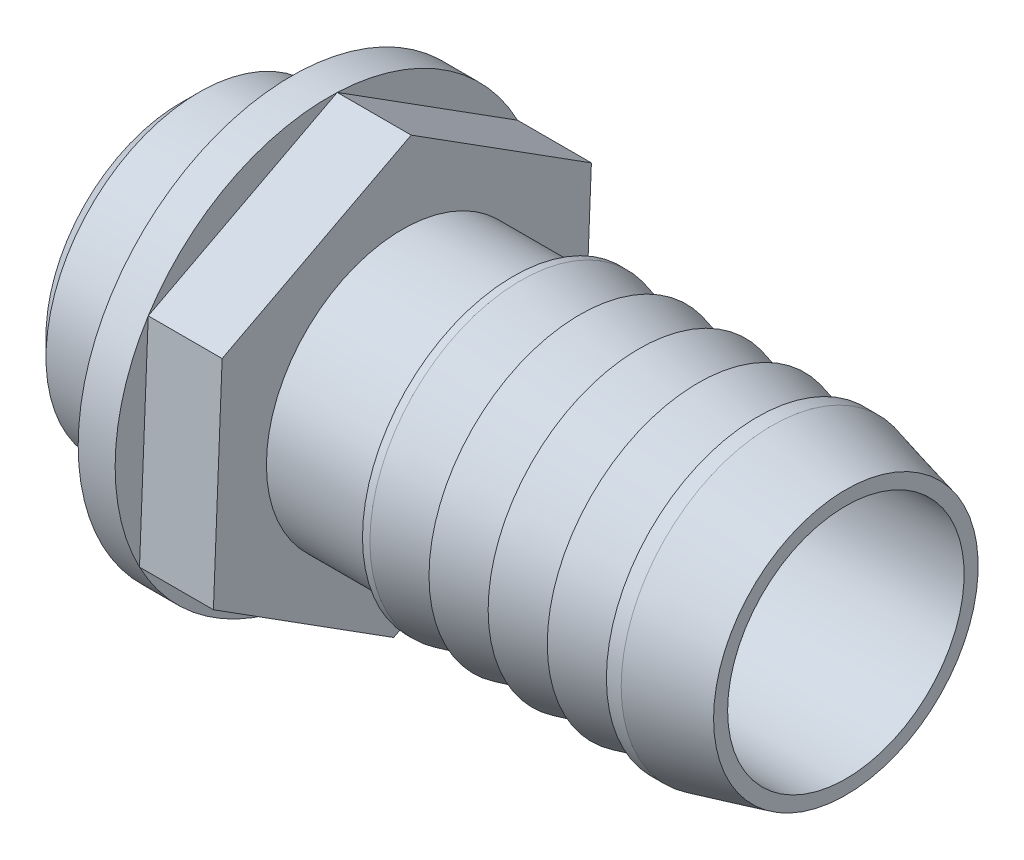
ISO-10303-21;
HEADER;
FILE_DESCRIPTION(('STEP AP214'),'2;1');
FILE_NAME('part.step','',(''),(''),'','','');
FILE_SCHEMA(('AUTOMOTIVE_DESIGN { 1 0 10303 214 1 1 1 1 }'));
ENDSEC;
DATA;
#1=APPLICATION_CONTEXT('core data for automotive mechanical design processes');
#2=APPLICATION_PROTOCOL_DEFINITION('international standard','automotive_design',2000,#1);
#3=PRODUCT_CONTEXT('',#1,'mechanical');
#4=PRODUCT('Part','Part','',(#3));
#5=PRODUCT_RELATED_PRODUCT_CATEGORY('part','',(#4));
#6=PRODUCT_DEFINITION_FORMATION('','',#4);
#7=PRODUCT_DEFINITION_CONTEXT('part definition',#1,'design');
#8=PRODUCT_DEFINITION('design','',#6,#7);
#9=PRODUCT_DEFINITION_SHAPE('','',#8);
#10=(LENGTH_UNIT() NAMED_UNIT(*) SI_UNIT(.MILLI.,.METRE.));
#11=(NAMED_UNIT(*) PLANE_ANGLE_UNIT() SI_UNIT($,.RADIAN.));
#12=(NAMED_UNIT(*) SI_UNIT($,.STERADIAN.) SOLID_ANGLE_UNIT());
#13=UNCERTAINTY_MEASURE_WITH_UNIT(LENGTH_MEASURE(1.E-05),#10,'distance_accuracy_value','');
#14=(GEOMETRIC_REPRESENTATION_CONTEXT(3) GLOBAL_UNCERTAINTY_ASSIGNED_CONTEXT((#13)) GLOBAL_UNIT_ASSIGNED_CONTEXT((#10,
#11,#12)) REPRESENTATION_CONTEXT('',''));
#15=CARTESIAN_POINT('',(0.,0.,0.));
#16=DIRECTION('',(0.,0.,1.));
#17=DIRECTION('',(1.,0.,0.));
#18=AXIS2_PLACEMENT_3D('',#15,#16,#17);
#19=CARTESIAN_POINT('',(-4.7625,0.,0.));
#20=DIRECTION('',(-1.,0.,0.));
#21=DIRECTION('',(0.,0.,1.));
#22=AXIS2_PLACEMENT_3D('',#19,#20,#21);
#23=PLANE('',#22);
#24=CARTESIAN_POINT('',(-4.7625,0.,0.));
#25=DIRECTION('',(-1.,0.,0.));
#26=DIRECTION('',(0.,0.,1.));
#27=AXIS2_PLACEMENT_3D('',#24,#25,#26);
#28=CIRCLE('',#27,9.16543552338531);
#29=CARTESIAN_POINT('',(-4.7625,0.,9.16543552338531));
#30=VERTEX_POINT('',#29);
#31=EDGE_CURVE('E140',#30,#30,#28,.T.);
#32=ORIENTED_EDGE('',*,*,#31,.T.);
#33=EDGE_LOOP('',(#32));
#34=FACE_BOUND('',#33,.T.);
#35=CARTESIAN_POINT('',(-4.7625,0.,0.));
#36=DIRECTION('',(-1.,0.,0.));
#37=DIRECTION('',(0.,0.,1.));
#38=AXIS2_PLACEMENT_3D('',#35,#36,#37);
#39=CIRCLE('',#38,6.5786);
#40=CARTESIAN_POINT('',(-4.7625,0.,-6.5786));
#41=VERTEX_POINT('',#40);
#42=EDGE_CURVE('E146',#41,#41,#39,.T.);
#43=ORIENTED_EDGE('',*,*,#42,.F.);
#44=EDGE_LOOP('',(#43));
#45=FACE_BOUND('',#44,.T.);
#46=ADVANCED_FACE('F39',(#34,#45),#23,.T.);
#47=CARTESIAN_POINT('',(0.,0.,0.));
#48=DIRECTION('',(-1.,0.,0.));
#49=DIRECTION('',(0.,0.,1.));
#50=AXIS2_PLACEMENT_3D('',#47,#48,#49);
#51=CYLINDRICAL_SURFACE('',#50,5.08);
#52=CARTESIAN_POINT('',(19.05,0.,0.));
#53=DIRECTION('',(-1.,0.,0.));
#54=DIRECTION('',(0.,0.,1.));
#55=AXIS2_PLACEMENT_3D('',#52,#53,#54);
#56=CIRCLE('',#55,5.08);
#57=CARTESIAN_POINT('',(19.05,0.,5.08));
#58=VERTEX_POINT('',#57);
#59=EDGE_CURVE('E174',#58,#58,#56,.T.);
#60=ORIENTED_EDGE('',*,*,#59,.F.);
#61=EDGE_LOOP('',(#60));
#62=FACE_BOUND('',#61,.T.);
#63=CARTESIAN_POINT('',(-9.525,0.,0.));
#64=DIRECTION('',(-1.,0.,0.));
#65=DIRECTION('',(0.,0.,1.));
#66=AXIS2_PLACEMENT_3D('',#63,#64,#65);
#67=CIRCLE('',#66,5.08000000000001);
#68=CARTESIAN_POINT('',(-9.525,0.,5.08000000000001));
#69=VERTEX_POINT('',#68);
#70=EDGE_CURVE('E149',#69,#69,#67,.T.);
#71=ORIENTED_EDGE('',*,*,#70,.T.);
#72=EDGE_LOOP('',(#71));
#73=FACE_BOUND('',#72,.T.);
#74=ADVANCED_FACE('F157',(#62,#73),#51,.F.);
#75=CARTESIAN_POINT('',(19.05,5.08,0.));
#76=DIRECTION('',(-1.,0.,0.));
#77=DIRECTION('',(0.,0.,1.));
#78=AXIS2_PLACEMENT_3D('',#75,#76,#77);
#79=PLANE('',#78);
#80=CARTESIAN_POINT('',(19.05,0.,0.));
#81=DIRECTION('',(-1.,0.,0.));
#82=DIRECTION('',(0.,0.,1.));
#83=AXIS2_PLACEMENT_3D('',#80,#81,#82);
#84=CIRCLE('',#83,5.68325000000001);
#85=CARTESIAN_POINT('',(19.05,0.,5.68325000000001));
#86=VERTEX_POINT('',#85);
#87=EDGE_CURVE('E167',#86,#86,#84,.F.);
#88=ORIENTED_EDGE('',*,*,#87,.T.);
#89=EDGE_LOOP('',(#88));
#90=FACE_BOUND('',#89,.T.);
#91=ORIENTED_EDGE('',*,*,#59,.T.);
#92=EDGE_LOOP('',(#91));
#93=FACE_BOUND('',#92,.T.);
#94=ADVANCED_FACE('F271',(#90,#93),#79,.F.);
#95=CARTESIAN_POINT('',(0.,0.,0.));
#96=DIRECTION('',(-1.,0.,0.));
#97=DIRECTION('',(0.,0.,1.));
#98=AXIS2_PLACEMENT_3D('',#95,#96,#97);
#99=CYLINDRICAL_SURFACE('',#98,6.477);
#100=CARTESIAN_POINT('',(15.875,0.,0.));
#101=DIRECTION('',(-1.,0.,0.));
#102=DIRECTION('',(0.,0.,1.));
#103=AXIS2_PLACEMENT_3D('',#100,#101,#102);
#104=CIRCLE('',#103,6.477);
#105=CARTESIAN_POINT('',(15.875,0.,6.477));
#106=VERTEX_POINT('',#105);
#107=EDGE_CURVE('E169',#106,#106,#104,.T.);
#108=ORIENTED_EDGE('',*,*,#107,.T.);
#109=EDGE_LOOP('',(#108));
#110=FACE_BOUND('',#109,.T.);
#111=CARTESIAN_POINT('',(15.24,0.,0.));
#112=DIRECTION('',(-1.,0.,0.));
#113=DIRECTION('',(0.,0.,1.));
#114=AXIS2_PLACEMENT_3D('',#111,#112,#113);
#115=CIRCLE('',#114,6.477);
#116=CARTESIAN_POINT('',(15.24,0.,6.477));
#117=VERTEX_POINT('',#116);
#118=EDGE_CURVE('E177',#117,#117,#115,.T.);
#119=ORIENTED_EDGE('',*,*,#118,.F.);
#120=EDGE_LOOP('',(#119));
#121=FACE_BOUND('',#120,.T.);
#122=ADVANCED_FACE('F400',(#110,#121),#99,.T.);
#123=CARTESIAN_POINT('',(15.24,6.477,0.));
#124=DIRECTION('',(1.,0.,0.));
#125=DIRECTION('',(0.,0.,-1.));
#126=AXIS2_PLACEMENT_3D('',#123,#124,#125);
#127=PLANE('',#126);
#128=CARTESIAN_POINT('',(15.24,0.,0.));
#129=DIRECTION('',(-1.,0.,0.));
#130=DIRECTION('',(0.,0.,1.));
#131=AXIS2_PLACEMENT_3D('',#128,#129,#130);
#132=CIRCLE('',#131,5.842);
#133=CARTESIAN_POINT('',(15.24,0.,5.842));
#134=VERTEX_POINT('',#133);
#135=EDGE_CURVE('E180',#134,#134,#132,.T.);
#136=ORIENTED_EDGE('',*,*,#135,.F.);
#137=EDGE_LOOP('',(#136));
#138=FACE_BOUND('',#137,.T.);
#139=ORIENTED_EDGE('',*,*,#118,.T.);
#140=EDGE_LOOP('',(#139));
#141=FACE_BOUND('',#140,.T.);
#142=ADVANCED_FACE('F409',(#138,#141),#127,.F.);
#143=CARTESIAN_POINT('',(15.24,0.,0.));
#144=DIRECTION('',(-1.,0.,0.));
#145=DIRECTION('',(0.,0.,1.));
#146=AXIS2_PLACEMENT_3D('',#143,#144,#145);
#147=CONICAL_SURFACE('',#146,5.842,0.244978663126864);
#148=CARTESIAN_POINT('',(12.7,0.,0.));
#149=DIRECTION('',(-1.,0.,0.));
#150=DIRECTION('',(0.,0.,1.));
#151=AXIS2_PLACEMENT_3D('',#148,#149,#150);
#152=CIRCLE('',#151,6.477);
#153=CARTESIAN_POINT('',(12.7,0.,6.477));
#154=VERTEX_POINT('',#153);
#155=EDGE_CURVE('E183',#154,#154,#152,.T.);
#156=ORIENTED_EDGE('',*,*,#155,.F.);
#157=EDGE_LOOP('',(#156));
#158=FACE_BOUND('',#157,.T.);
#159=ORIENTED_EDGE('',*,*,#135,.T.);
#160=EDGE_LOOP('',(#159));
#161=FACE_BOUND('',#160,.T.);
#162=ADVANCED_FACE('F418',(#158,#161),#147,.T.);
#163=CARTESIAN_POINT('',(12.7,6.477,0.));
#164=DIRECTION('',(1.,0.,0.));
#165=DIRECTION('',(0.,0.,-1.));
#166=AXIS2_PLACEMENT_3D('',#163,#164,#165);
#167=PLANE('',#166);
#168=CARTESIAN_POINT('',(12.7,0.,0.));
#169=DIRECTION('',(-1.,0.,0.));
#170=DIRECTION('',(0.,0.,1.));
#171=AXIS2_PLACEMENT_3D('',#168,#169,#170);
#172=CIRCLE('',#171,5.842);
#173=CARTESIAN_POINT('',(12.7,0.,5.842));
#174=VERTEX_POINT('',#173);
#175=EDGE_CURVE('E186',#174,#174,#172,.T.);
#176=ORIENTED_EDGE('',*,*,#175,.F.);
#177=EDGE_LOOP('',(#176));
#178=FACE_BOUND('',#177,.T.);
#179=ORIENTED_EDGE('',*,*,#155,.T.);
#180=EDGE_LOOP('',(#179));
#181=FACE_BOUND('',#180,.T.);
#182=ADVANCED_FACE('F426',(#178,#181),#167,.F.);
#183=CARTESIAN_POINT('',(12.7,0.,0.));
#184=DIRECTION('',(-1.,0.,0.));
#185=DIRECTION('',(0.,0.,1.));
#186=AXIS2_PLACEMENT_3D('',#183,#184,#185);
#187=CONICAL_SURFACE('',#186,5.842,0.244978663126864);
#188=CARTESIAN_POINT('',(10.16,0.,0.));
#189=DIRECTION('',(-1.,0.,0.));
#190=DIRECTION('',(0.,0.,1.));
#191=AXIS2_PLACEMENT_3D('',#188,#189,#190);
#192=CIRCLE('',#191,6.477);
#193=CARTESIAN_POINT('',(10.16,0.,6.477));
#194=VERTEX_POINT('',#193);
#195=EDGE_CURVE('E189',#194,#194,#192,.T.);
#196=ORIENTED_EDGE('',*,*,#195,.F.);
#197=EDGE_LOOP('',(#196));
#198=FACE_BOUND('',#197,.T.);
#199=ORIENTED_EDGE('',*,*,#175,.T.);
#200=EDGE_LOOP('',(#199));
#201=FACE_BOUND('',#200,.T.);
#202=ADVANCED_FACE('F434',(#198,#201),#187,.T.);
#203=CARTESIAN_POINT('',(10.16,6.477,0.));
#204=DIRECTION('',(1.,0.,0.));
#205=DIRECTION('',(0.,0.,-1.));
#206=AXIS2_PLACEMENT_3D('',#203,#204,#205);
#207=PLANE('',#206);
#208=CARTESIAN_POINT('',(10.16,0.,0.));
#209=DIRECTION('',(-1.,0.,0.));
#210=DIRECTION('',(0.,0.,1.));
#211=AXIS2_PLACEMENT_3D('',#208,#209,#210);
#212=CIRCLE('',#211,5.842);
#213=CARTESIAN_POINT('',(10.16,0.,5.842));
#214=VERTEX_POINT('',#213);
#215=EDGE_CURVE('E192',#214,#214,#212,.T.);
#216=ORIENTED_EDGE('',*,*,#215,.F.);
#217=EDGE_LOOP('',(#216));
#218=FACE_BOUND('',#217,.T.);
#219=ORIENTED_EDGE('',*,*,#195,.T.);
#220=EDGE_LOOP('',(#219));
#221=FACE_BOUND('',#220,.T.);
#222=ADVANCED_FACE('F442',(#218,#221),#207,.F.);
#223=CARTESIAN_POINT('',(10.16,0.,0.));
#224=DIRECTION('',(-1.,0.,0.));
#225=DIRECTION('',(0.,0.,1.));
#226=AXIS2_PLACEMENT_3D('',#223,#224,#225);
#227=CONICAL_SURFACE('',#226,5.842,0.244978663126864);
#228=CARTESIAN_POINT('',(7.62,0.,0.));
#229=DIRECTION('',(-1.,0.,0.));
#230=DIRECTION('',(0.,0.,1.));
#231=AXIS2_PLACEMENT_3D('',#228,#229,#230);
#232=CIRCLE('',#231,6.477);
#233=CARTESIAN_POINT('',(7.62,0.,6.477));
#234=VERTEX_POINT('',#233);
#235=EDGE_CURVE('E195',#234,#234,#232,.T.);
#236=ORIENTED_EDGE('',*,*,#235,.F.);
#237=EDGE_LOOP('',(#236));
#238=FACE_BOUND('',#237,.T.);
#239=ORIENTED_EDGE('',*,*,#215,.T.);
#240=EDGE_LOOP('',(#239));
#241=FACE_BOUND('',#240,.T.);
#242=ADVANCED_FACE('F450',(#238,#241),#227,.T.);
#243=CARTESIAN_POINT('',(7.62,6.477,0.));
#244=DIRECTION('',(1.,0.,0.));
#245=DIRECTION('',(0.,0.,-1.));
#246=AXIS2_PLACEMENT_3D('',#243,#244,#245);
#247=PLANE('',#246);
#248=CARTESIAN_POINT('',(7.62,0.,0.));
#249=DIRECTION('',(-1.,0.,0.));
#250=DIRECTION('',(0.,0.,1.));
#251=AXIS2_PLACEMENT_3D('',#248,#249,#250);
#252=CIRCLE('',#251,5.842);
#253=CARTESIAN_POINT('',(7.62,0.,5.842));
#254=VERTEX_POINT('',#253);
#255=EDGE_CURVE('E198',#254,#254,#252,.T.);
#256=ORIENTED_EDGE('',*,*,#255,.F.);
#257=EDGE_LOOP('',(#256));
#258=FACE_BOUND('',#257,.T.);
#259=ORIENTED_EDGE('',*,*,#235,.T.);
#260=EDGE_LOOP('',(#259));
#261=FACE_BOUND('',#260,.T.);
#262=ADVANCED_FACE('F458',(#258,#261),#247,.F.);
#263=CARTESIAN_POINT('',(7.62,0.,0.));
#264=DIRECTION('',(-1.,0.,0.));
#265=DIRECTION('',(0.,0.,1.));
#266=AXIS2_PLACEMENT_3D('',#263,#264,#265);
#267=CONICAL_SURFACE('',#266,5.842,0.244978663126864);
#268=CARTESIAN_POINT('',(5.08,0.,0.));
#269=DIRECTION('',(-1.,0.,0.));
#270=DIRECTION('',(0.,0.,1.));
#271=AXIS2_PLACEMENT_3D('',#268,#269,#270);
#272=CIRCLE('',#271,6.477);
#273=CARTESIAN_POINT('',(5.08,0.,6.477));
#274=VERTEX_POINT('',#273);
#275=EDGE_CURVE('E201',#274,#274,#272,.T.);
#276=ORIENTED_EDGE('',*,*,#275,.F.);
#277=EDGE_LOOP('',(#276));
#278=FACE_BOUND('',#277,.T.);
#279=ORIENTED_EDGE('',*,*,#255,.T.);
#280=EDGE_LOOP('',(#279));
#281=FACE_BOUND('',#280,.T.);
#282=ADVANCED_FACE('F466',(#278,#281),#267,.T.);
#283=CARTESIAN_POINT('',(0.,0.,0.));
#284=DIRECTION('',(-1.,0.,0.));
#285=DIRECTION('',(0.,0.,1.));
#286=AXIS2_PLACEMENT_3D('',#283,#284,#285);
#287=CYLINDRICAL_SURFACE('',#286,6.477);
#288=CARTESIAN_POINT('',(4.7625,0.,0.));
#289=DIRECTION('',(-1.,0.,0.));
#290=DIRECTION('',(0.,0.,1.));
#291=AXIS2_PLACEMENT_3D('',#288,#289,#290);
#292=CIRCLE('',#291,6.477);
#293=CARTESIAN_POINT('',(4.7625,0.,6.477));
#294=VERTEX_POINT('',#293);
#295=EDGE_CURVE('E204',#294,#294,#292,.T.);
#296=ORIENTED_EDGE('',*,*,#295,.F.);
#297=EDGE_LOOP('',(#296));
#298=FACE_BOUND('',#297,.T.);
#299=ORIENTED_EDGE('',*,*,#275,.T.);
#300=EDGE_LOOP('',(#299));
#301=FACE_BOUND('',#300,.T.);
#302=ADVANCED_FACE('F474',(#298,#301),#287,.T.);
#303=CARTESIAN_POINT('',(4.7625,6.477,0.));
#304=DIRECTION('',(1.,0.,0.));
#305=DIRECTION('',(0.,0.,-1.));
#306=AXIS2_PLACEMENT_3D('',#303,#304,#305);
#307=PLANE('',#306);
#308=CARTESIAN_POINT('',(4.7625,0.,0.));
#309=DIRECTION('',(-1.,0.,0.));
#310=DIRECTION('',(0.,0.,1.));
#311=AXIS2_PLACEMENT_3D('',#308,#309,#310);
#312=CIRCLE('',#311,5.842);
#313=CARTESIAN_POINT('',(4.7625,0.,5.842));
#314=VERTEX_POINT('',#313);
#315=EDGE_CURVE('E207',#314,#314,#312,.T.);
#316=ORIENTED_EDGE('',*,*,#315,.F.);
#317=EDGE_LOOP('',(#316));
#318=FACE_BOUND('',#317,.T.);
#319=ORIENTED_EDGE('',*,*,#295,.T.);
#320=EDGE_LOOP('',(#319));
#321=FACE_BOUND('',#320,.T.);
#322=ADVANCED_FACE('F482',(#318,#321),#307,.F.);
#323=CARTESIAN_POINT('',(0.,0.,0.));
#324=DIRECTION('',(-1.,0.,0.));
#325=DIRECTION('',(0.,0.,1.));
#326=AXIS2_PLACEMENT_3D('',#323,#324,#325);
#327=CYLINDRICAL_SURFACE('',#326,5.842);
#328=CARTESIAN_POINT('',(0.,0.,0.));
#329=DIRECTION('',(-1.,0.,0.));
#330=DIRECTION('',(0.,0.,1.));
#331=AXIS2_PLACEMENT_3D('',#328,#329,#330);
#332=CIRCLE('',#331,5.842);
#333=CARTESIAN_POINT('',(0.,0.,5.842));
#334=VERTEX_POINT('',#333);
#335=EDGE_CURVE('E210',#334,#334,#332,.T.);
#336=ORIENTED_EDGE('',*,*,#335,.F.);
#337=EDGE_LOOP('',(#336));
#338=FACE_BOUND('',#337,.T.);
#339=ORIENTED_EDGE('',*,*,#315,.T.);
#340=EDGE_LOOP('',(#339));
#341=FACE_BOUND('',#340,.T.);
#342=ADVANCED_FACE('F490',(#338,#341),#327,.T.);
#343=CARTESIAN_POINT('',(15.875,0.,0.));
#344=DIRECTION('',(-1.,0.,0.));
#345=DIRECTION('',(0.,0.,1.));
#346=AXIS2_PLACEMENT_3D('',#343,#344,#345);
#347=CONICAL_SURFACE('',#346,6.477,0.244978663126861);
#348=ORIENTED_EDGE('',*,*,#87,.F.);
#349=EDGE_LOOP('',(#348));
#350=FACE_BOUND('',#349,.T.);
#351=ORIENTED_EDGE('',*,*,#107,.F.);
#352=EDGE_LOOP('',(#351));
#353=FACE_BOUND('',#352,.T.);
#354=ADVANCED_FACE('F286',(#350,#353),#347,.T.);
#355=CARTESIAN_POINT('',(-3.175,-9.15772486519983,0.375877143005609));
#356=DIRECTION('',(0.,0.885801981250048,0.464063411629799));
#357=DIRECTION('',(0.,-0.464063411629799,0.885801981250049));
#358=AXIS2_PLACEMENT_3D('',#355,#356,#357);
#359=PLANE('',#358);
#360=DIRECTION('',(0.,-0.464063411629799,0.885801981250048));
#361=VECTOR('',#360,1.);
#362=CARTESIAN_POINT('',(0.,-9.15772486519983,0.375877143005609));
#363=LINE('',#362,#361);
#364=CARTESIAN_POINT('',(0.,-4.90438158714469,-7.74288380262867));
#365=VERTEX_POINT('',#364);
#366=CARTESIAN_POINT('',(0.,-9.15772486519983,0.375877143005609));
#367=VERTEX_POINT('',#366);
#368=EDGE_CURVE('E84',#365,#367,#363,.T.);
#369=ORIENTED_EDGE('',*,*,#368,.T.);
#370=DIRECTION('',(1.,0.,0.));
#371=VECTOR('',#370,1.);
#372=CARTESIAN_POINT('',(-3.175,-9.15772486519983,0.375877143005609));
#373=LINE('',#372,#371);
#374=CARTESIAN_POINT('',(-3.175,-9.15772486519983,0.375877143005607));
#375=VERTEX_POINT('',#374);
#376=EDGE_CURVE('E218',#375,#367,#373,.T.);
#377=ORIENTED_EDGE('',*,*,#376,.F.);
#378=DIRECTION('',(0.,-0.464063411629799,0.885801981250048));
#379=VECTOR('',#378,1.);
#380=CARTESIAN_POINT('',(-3.175,-9.15772486519983,0.375877143005609));
#381=LINE('',#380,#379);
#382=CARTESIAN_POINT('',(-3.175,-4.90438158714469,-7.74288380262867));
#383=VERTEX_POINT('',#382);
#384=EDGE_CURVE('E220',#383,#375,#381,.T.);
#385=ORIENTED_EDGE('',*,*,#384,.F.);
#386=DIRECTION('',(1.,0.,0.));
#387=VECTOR('',#386,1.);
#388=CARTESIAN_POINT('',(-3.175,-4.90438158714469,-7.74288380262867));
#389=LINE('',#388,#387);
#390=EDGE_CURVE('E56',#383,#365,#389,.T.);
#391=ORIENTED_EDGE('',*,*,#390,.T.);
#392=EDGE_LOOP('',(#369,#377,#385,#391));
#393=FACE_BOUND('',#392,.T.);
#394=ADVANCED_FACE('F247',(#393),#359,.F.);
#395=CARTESIAN_POINT('',(-3.175,-4.90438158714469,-7.74288380262867));
#396=DIRECTION('',(0.,0.0410102871867436,0.999158724300029));
#397=DIRECTION('',(0.,-0.999158724300029,0.0410102871867436));
#398=AXIS2_PLACEMENT_3D('',#395,#396,#397);
#399=PLANE('',#398);
#400=DIRECTION('',(0.,-0.999158724300029,0.0410102871867436));
#401=VECTOR('',#400,1.);
#402=CARTESIAN_POINT('',(0.,-4.90438158714469,-7.74288380262867));
#403=LINE('',#402,#401);
#404=CARTESIAN_POINT('',(0.,4.25334327805514,-8.11876094563429));
#405=VERTEX_POINT('',#404);
#406=EDGE_CURVE('E78',#405,#365,#403,.T.);
#407=ORIENTED_EDGE('',*,*,#406,.T.);
#408=ORIENTED_EDGE('',*,*,#390,.F.);
#409=DIRECTION('',(0.,-0.999158724300029,0.0410102871867436));
#410=VECTOR('',#409,1.);
#411=CARTESIAN_POINT('',(-3.175,-4.90438158714469,-7.74288380262867));
#412=LINE('',#411,#410);
#413=CARTESIAN_POINT('',(-3.175,4.25334327805514,-8.11876094563429));
#414=VERTEX_POINT('',#413);
#415=EDGE_CURVE('E120',#414,#383,#412,.T.);
#416=ORIENTED_EDGE('',*,*,#415,.F.);
#417=DIRECTION('',(1.,0.,0.));
#418=VECTOR('',#417,1.);
#419=CARTESIAN_POINT('',(-3.175,4.25334327805514,-8.11876094563429));
#420=LINE('',#419,#418);
#421=EDGE_CURVE('E112',#414,#405,#420,.T.);
#422=ORIENTED_EDGE('',*,*,#421,.T.);
#423=EDGE_LOOP('',(#407,#408,#416,#422));
#424=FACE_BOUND('',#423,.T.);
#425=ADVANCED_FACE('F250',(#424),#399,.F.);
#426=CARTESIAN_POINT('',(-3.175,4.25334327805514,-8.11876094563429));
#427=DIRECTION('',(0.,-0.844791694063305,0.53509531267023));
#428=DIRECTION('',(0.,-0.53509531267023,-0.844791694063305));
#429=AXIS2_PLACEMENT_3D('',#426,#427,#428);
#430=PLANE('',#429);
#431=DIRECTION('',(0.,-0.53509531267023,-0.844791694063305));
#432=VECTOR('',#431,1.);
#433=CARTESIAN_POINT('',(0.,4.25334327805514,-8.11876094563429));
#434=LINE('',#433,#432);
#435=CARTESIAN_POINT('',(0.,9.15772486519983,-0.375877143005614));
#436=VERTEX_POINT('',#435);
#437=EDGE_CURVE('E224',#436,#405,#434,.T.);
#438=ORIENTED_EDGE('',*,*,#437,.T.);
#439=ORIENTED_EDGE('',*,*,#421,.F.);
#440=DIRECTION('',(0.,-0.53509531267023,-0.844791694063305));
#441=VECTOR('',#440,1.);
#442=CARTESIAN_POINT('',(-3.175,4.25334327805514,-8.11876094563429));
#443=LINE('',#442,#441);
#444=CARTESIAN_POINT('',(-3.175,9.15772486519983,-0.375877143005614));
#445=VERTEX_POINT('',#444);
#446=EDGE_CURVE('E115',#445,#414,#443,.T.);
#447=ORIENTED_EDGE('',*,*,#446,.F.);
#448=DIRECTION('',(1.,0.,0.));
#449=VECTOR('',#448,1.);
#450=CARTESIAN_POINT('',(-3.175,9.15772486519983,-0.375877143005614));
#451=LINE('',#450,#449);
#452=EDGE_CURVE('E101',#445,#436,#451,.T.);
#453=ORIENTED_EDGE('',*,*,#452,.T.);
#454=EDGE_LOOP('',(#438,#439,#447,#453));
#455=FACE_BOUND('',#454,.T.);
#456=ADVANCED_FACE('F116',(#455),#430,.F.);
#457=CARTESIAN_POINT('',(-3.175,9.15772486519983,-0.375877143005614));
#458=DIRECTION('',(0.,-0.885801981250049,-0.464063411629799));
#459=DIRECTION('',(0.,0.464063411629799,-0.885801981250049));
#460=AXIS2_PLACEMENT_3D('',#457,#458,#459);
#461=PLANE('',#460);
#462=DIRECTION('',(0.,0.464063411629799,-0.885801981250049));
#463=VECTOR('',#462,1.);
#464=CARTESIAN_POINT('',(0.,9.15772486519983,-0.375877143005614));
#465=LINE('',#464,#463);
#466=CARTESIAN_POINT('',(0.,4.90438158714469,7.74288380262867));
#467=VERTEX_POINT('',#466);
#468=EDGE_CURVE('E108',#467,#436,#465,.T.);
#469=ORIENTED_EDGE('',*,*,#468,.T.);
#470=ORIENTED_EDGE('',*,*,#452,.F.);
#471=DIRECTION('',(0.,0.464063411629799,-0.885801981250049));
#472=VECTOR('',#471,1.);
#473=CARTESIAN_POINT('',(-3.175,9.15772486519983,-0.375877143005614));
#474=LINE('',#473,#472);
#475=CARTESIAN_POINT('',(-3.175,4.90438158714469,7.74288380262867));
#476=VERTEX_POINT('',#475);
#477=EDGE_CURVE('E106',#476,#445,#474,.T.);
#478=ORIENTED_EDGE('',*,*,#477,.F.);
#479=DIRECTION('',(1.,0.,0.));
#480=VECTOR('',#479,1.);
#481=CARTESIAN_POINT('',(-3.175,4.90438158714469,7.74288380262867));
#482=LINE('',#481,#480);
#483=EDGE_CURVE('E111',#476,#467,#482,.T.);
#484=ORIENTED_EDGE('',*,*,#483,.T.);
#485=EDGE_LOOP('',(#469,#470,#478,#484));
#486=FACE_BOUND('',#485,.T.);
#487=ADVANCED_FACE('F103',(#486),#461,.F.);
#488=CARTESIAN_POINT('',(-3.175,4.90438158714469,7.74288380262867));
#489=DIRECTION('',(0.,-0.0410102871867433,-0.999158724300029));
#490=DIRECTION('',(0.,0.999158724300029,-0.0410102871867433));
#491=AXIS2_PLACEMENT_3D('',#488,#489,#490);
#492=PLANE('',#491);
#493=DIRECTION('',(0.,0.999158724300029,-0.0410102871867433));
#494=VECTOR('',#493,1.);
#495=CARTESIAN_POINT('',(0.,4.90438158714469,7.74288380262867));
#496=LINE('',#495,#494);
#497=CARTESIAN_POINT('',(0.,-4.25334327805514,8.11876094563428));
#498=VERTEX_POINT('',#497);
#499=EDGE_CURVE('E227',#498,#467,#496,.T.);
#500=ORIENTED_EDGE('',*,*,#499,.T.);
#501=ORIENTED_EDGE('',*,*,#483,.F.);
#502=DIRECTION('',(0.,0.999158724300029,-0.0410102871867433));
#503=VECTOR('',#502,1.);
#504=CARTESIAN_POINT('',(-3.175,4.90438158714469,7.74288380262867));
#505=LINE('',#504,#503);
#506=CARTESIAN_POINT('',(-3.175,-4.25334327805514,8.11876094563428));
#507=VERTEX_POINT('',#506);
#508=EDGE_CURVE('E93',#507,#476,#505,.T.);
#509=ORIENTED_EDGE('',*,*,#508,.F.);
#510=DIRECTION('',(1.,0.,0.));
#511=VECTOR('',#510,1.);
#512=CARTESIAN_POINT('',(-3.175,-4.25334327805514,8.11876094563428));
#513=LINE('',#512,#511);
#514=EDGE_CURVE('E213',#507,#498,#513,.T.);
#515=ORIENTED_EDGE('',*,*,#514,.T.);
#516=EDGE_LOOP('',(#500,#501,#509,#515));
#517=FACE_BOUND('',#516,.T.);
#518=ADVANCED_FACE('F256',(#517),#492,.F.);
#519=CARTESIAN_POINT('',(-3.175,-4.25334327805514,8.11876094563428));
#520=DIRECTION('',(0.,0.844791694063305,-0.535095312670229));
#521=DIRECTION('',(0.,0.535095312670229,0.844791694063305));
#522=AXIS2_PLACEMENT_3D('',#519,#520,#521);
#523=PLANE('',#522);
#524=DIRECTION('',(0.,0.535095312670229,0.844791694063305));
#525=VECTOR('',#524,1.);
#526=CARTESIAN_POINT('',(0.,-4.25334327805514,8.11876094563428));
#527=LINE('',#526,#525);
#528=EDGE_CURVE('E142',#367,#498,#527,.T.);
#529=ORIENTED_EDGE('',*,*,#528,.T.);
#530=ORIENTED_EDGE('',*,*,#514,.F.);
#531=DIRECTION('',(0.,0.535095312670229,0.844791694063305));
#532=VECTOR('',#531,1.);
#533=CARTESIAN_POINT('',(-3.175,-4.25334327805514,8.11876094563428));
#534=LINE('',#533,#532);
#535=EDGE_CURVE('E222',#375,#507,#534,.T.);
#536=ORIENTED_EDGE('',*,*,#535,.F.);
#537=ORIENTED_EDGE('',*,*,#376,.T.);
#538=EDGE_LOOP('',(#529,#530,#536,#537));
#539=FACE_BOUND('',#538,.T.);
#540=ADVANCED_FACE('F255',(#539),#523,.F.);
#541=CARTESIAN_POINT('',(0.,0.,0.));
#542=DIRECTION('',(1.,0.,0.));
#543=DIRECTION('',(0.,0.,-1.));
#544=AXIS2_PLACEMENT_3D('',#541,#542,#543);
#545=PLANE('',#544);
#546=ORIENTED_EDGE('',*,*,#528,.F.);
#547=ORIENTED_EDGE('',*,*,#368,.F.);
#548=ORIENTED_EDGE('',*,*,#406,.F.);
#549=ORIENTED_EDGE('',*,*,#437,.F.);
#550=ORIENTED_EDGE('',*,*,#468,.F.);
#551=ORIENTED_EDGE('',*,*,#499,.F.);
#552=EDGE_LOOP('',(#546,#547,#548,#549,#550,#551));
#553=FACE_BOUND('',#552,.T.);
#554=ORIENTED_EDGE('',*,*,#335,.T.);
#555=EDGE_LOOP('',(#554));
#556=FACE_BOUND('',#555,.T.);
#557=ADVANCED_FACE('F253',(#553,#556),#545,.T.);
#558=CARTESIAN_POINT('',(-3.175,0.,0.));
#559=DIRECTION('',(-1.,0.,0.));
#560=DIRECTION('',(0.,0.,1.));
#561=AXIS2_PLACEMENT_3D('',#558,#559,#560);
#562=PLANE('',#561);
#563=CARTESIAN_POINT('',(-3.175,0.,0.));
#564=DIRECTION('',(-1.,0.,0.));
#565=DIRECTION('',(0.,0.,1.));
#566=AXIS2_PLACEMENT_3D('',#563,#564,#565);
#567=CIRCLE('',#566,9.16543552338531);
#568=EDGE_CURVE('E145',#375,#507,#567,.T.);
#569=ORIENTED_EDGE('',*,*,#568,.F.);
#570=ORIENTED_EDGE('',*,*,#535,.T.);
#571=EDGE_LOOP('',(#569,#570));
#572=FACE_BOUND('',#571,.T.);
#573=ADVANCED_FACE('F239',(#572),#562,.F.);
#574=EDGE_CURVE('E139',#507,#476,#567,.T.);
#575=ORIENTED_EDGE('',*,*,#574,.F.);
#576=ORIENTED_EDGE('',*,*,#508,.T.);
#577=EDGE_LOOP('',(#575,#576));
#578=FACE_BOUND('',#577,.T.);
#579=ADVANCED_FACE('F243',(#578),#562,.F.);
#580=EDGE_CURVE('E126',#476,#445,#567,.T.);
#581=ORIENTED_EDGE('',*,*,#580,.F.);
#582=ORIENTED_EDGE('',*,*,#477,.T.);
#583=EDGE_LOOP('',(#581,#582));
#584=FACE_BOUND('',#583,.T.);
#585=ADVANCED_FACE('F124',(#584),#562,.F.);
#586=EDGE_CURVE('E129',#445,#414,#567,.T.);
#587=ORIENTED_EDGE('',*,*,#586,.F.);
#588=ORIENTED_EDGE('',*,*,#446,.T.);
#589=EDGE_LOOP('',(#587,#588));
#590=FACE_BOUND('',#589,.T.);
#591=ADVANCED_FACE('F130',(#590),#562,.F.);
#592=EDGE_CURVE('E133',#414,#383,#567,.T.);
#593=ORIENTED_EDGE('',*,*,#592,.F.);
#594=ORIENTED_EDGE('',*,*,#415,.T.);
#595=EDGE_LOOP('',(#593,#594));
#596=FACE_BOUND('',#595,.T.);
#597=ADVANCED_FACE('F249',(#596),#562,.F.);
#598=EDGE_CURVE('E147',#383,#375,#567,.T.);
#599=ORIENTED_EDGE('',*,*,#598,.F.);
#600=ORIENTED_EDGE('',*,*,#384,.T.);
#601=EDGE_LOOP('',(#599,#600));
#602=FACE_BOUND('',#601,.T.);
#603=ADVANCED_FACE('F246',(#602),#562,.F.);
#604=CARTESIAN_POINT('',(-4.7625,0.,0.));
#605=DIRECTION('',(1.,0.,0.));
#606=DIRECTION('',(0.,0.,-1.));
#607=AXIS2_PLACEMENT_3D('',#604,#605,#606);
#608=CYLINDRICAL_SURFACE('',#607,9.16543552338531);
#609=ORIENTED_EDGE('',*,*,#31,.F.);
#610=EDGE_LOOP('',(#609));
#611=FACE_BOUND('',#610,.T.);
#612=ORIENTED_EDGE('',*,*,#580,.T.);
#613=ORIENTED_EDGE('',*,*,#586,.T.);
#614=ORIENTED_EDGE('',*,*,#592,.T.);
#615=ORIENTED_EDGE('',*,*,#598,.T.);
#616=ORIENTED_EDGE('',*,*,#568,.T.);
#617=ORIENTED_EDGE('',*,*,#574,.T.);
#618=EDGE_LOOP('',(#612,#613,#614,#615,#616,#617));
#619=FACE_BOUND('',#618,.T.);
#620=ADVANCED_FACE('F136',(#611,#619),#608,.T.);
#621=CARTESIAN_POINT('',(-9.525,0.,0.));
#622=DIRECTION('',(1.,0.,0.));
#623=DIRECTION('',(0.,0.,-1.));
#624=AXIS2_PLACEMENT_3D('',#621,#622,#623);
#625=CYLINDRICAL_SURFACE('',#624,6.5786);
#626=CARTESIAN_POINT('',(-8.73125000000002,0.,0.));
#627=DIRECTION('',(-1.,0.,0.));
#628=DIRECTION('',(0.,0.,1.));
#629=AXIS2_PLACEMENT_3D('',#626,#627,#628);
#630=CIRCLE('',#629,6.5786);
#631=CARTESIAN_POINT('',(-8.73125000000002,0.,-6.5786));
#632=VERTEX_POINT('',#631);
#633=EDGE_CURVE('E11',#632,#632,#630,.F.);
#634=CARTESIAN_POINT('',(-8.73125000000002,0.,-6.5786));
#635=CARTESIAN_POINT('',(-8.68990885416668,0.,-6.5786));
#636=CARTESIAN_POINT('',(-8.64856770833335,0.,-6.5786));
#637=CARTESIAN_POINT('',(-8.56588541666668,0.,-6.5786));
#638=CARTESIAN_POINT('',(-8.52454427083335,0.,-6.5786));
#639=CARTESIAN_POINT('',(-8.44186197916668,0.,-6.5786));
#640=CARTESIAN_POINT('',(-8.40052083333335,0.,-6.5786));
#641=CARTESIAN_POINT('',(-8.31783854166668,0.,-6.5786));
#642=CARTESIAN_POINT('',(-8.27649739583335,0.,-6.5786));
#643=CARTESIAN_POINT('',(-8.19381510416668,0.,-6.5786));
#644=CARTESIAN_POINT('',(-8.15247395833335,0.,-6.5786));
#645=CARTESIAN_POINT('',(-8.06979166666668,0.,-6.5786));
#646=CARTESIAN_POINT('',(-8.02845052083334,0.,-6.5786));
#647=CARTESIAN_POINT('',(-7.94576822916668,0.,-6.5786));
#648=CARTESIAN_POINT('',(-7.90442708333334,0.,-6.5786));
#649=CARTESIAN_POINT('',(-7.82174479166668,0.,-6.5786));
#650=CARTESIAN_POINT('',(-7.78040364583334,0.,-6.5786));
#651=CARTESIAN_POINT('',(-7.69772135416668,0.,-6.5786));
#652=CARTESIAN_POINT('',(-7.65638020833334,0.,-6.5786));
#653=CARTESIAN_POINT('',(-7.57369791666668,0.,-6.5786));
#654=CARTESIAN_POINT('',(-7.53235677083334,0.,-6.5786));
#655=CARTESIAN_POINT('',(-7.44967447916668,0.,-6.5786));
#656=CARTESIAN_POINT('',(-7.40833333333334,0.,-6.5786));
#657=CARTESIAN_POINT('',(-7.32565104166668,0.,-6.5786));
#658=CARTESIAN_POINT('',(-7.28430989583334,0.,-6.5786));
#659=CARTESIAN_POINT('',(-7.20162760416668,0.,-6.5786));
#660=CARTESIAN_POINT('',(-7.16028645833334,0.,-6.5786));
#661=CARTESIAN_POINT('',(-7.07760416666668,0.,-6.5786));
#662=CARTESIAN_POINT('',(-7.03626302083334,0.,-6.5786));
#663=CARTESIAN_POINT('',(-6.95358072916667,0.,-6.5786));
#664=CARTESIAN_POINT('',(-6.91223958333334,0.,-6.5786));
#665=CARTESIAN_POINT('',(-6.82955729166667,0.,-6.5786));
#666=CARTESIAN_POINT('',(-6.78821614583334,0.,-6.5786));
#667=CARTESIAN_POINT('',(-6.70553385416667,0.,-6.5786));
#668=CARTESIAN_POINT('',(-6.66419270833334,0.,-6.5786));
#669=CARTESIAN_POINT('',(-6.58151041666667,0.,-6.5786));
#670=CARTESIAN_POINT('',(-6.54016927083334,0.,-6.5786));
#671=CARTESIAN_POINT('',(-6.45748697916667,0.,-6.5786));
#672=CARTESIAN_POINT('',(-6.41614583333334,0.,-6.5786));
#673=CARTESIAN_POINT('',(-6.33346354166667,0.,-6.5786));
#674=CARTESIAN_POINT('',(-6.29212239583334,0.,-6.5786));
#675=CARTESIAN_POINT('',(-6.20944010416667,0.,-6.5786));
#676=CARTESIAN_POINT('',(-6.16809895833334,0.,-6.5786));
#677=CARTESIAN_POINT('',(-6.08541666666667,0.,-6.5786));
#678=CARTESIAN_POINT('',(-6.04407552083334,0.,-6.5786));
#679=CARTESIAN_POINT('',(-5.96139322916667,0.,-6.5786));
#680=CARTESIAN_POINT('',(-5.92005208333334,0.,-6.5786));
#681=CARTESIAN_POINT('',(-5.83736979166667,0.,-6.5786));
#682=CARTESIAN_POINT('',(-5.79602864583334,0.,-6.5786));
#683=CARTESIAN_POINT('',(-5.71334635416667,0.,-6.5786));
#684=CARTESIAN_POINT('',(-5.67200520833334,0.,-6.5786));
#685=CARTESIAN_POINT('',(-5.58932291666667,0.,-6.5786));
#686=CARTESIAN_POINT('',(-5.54798177083334,0.,-6.5786));
#687=CARTESIAN_POINT('',(-5.46529947916667,0.,-6.5786));
#688=CARTESIAN_POINT('',(-5.42395833333334,0.,-6.5786));
#689=CARTESIAN_POINT('',(-5.34127604166667,0.,-6.5786));
#690=CARTESIAN_POINT('',(-5.29993489583334,0.,-6.5786));
#691=CARTESIAN_POINT('',(-5.21725260416667,0.,-6.5786));
#692=CARTESIAN_POINT('',(-5.17591145833334,0.,-6.5786));
#693=CARTESIAN_POINT('',(-5.09322916666667,0.,-6.5786));
#694=CARTESIAN_POINT('',(-5.05188802083333,0.,-6.5786));
#695=CARTESIAN_POINT('',(-4.96920572916667,0.,-6.5786));
#696=CARTESIAN_POINT('',(-4.92786458333333,0.,-6.5786));
#697=CARTESIAN_POINT('',(-4.84518229166667,0.,-6.5786));
#698=CARTESIAN_POINT('',(-4.80384114583333,0.,-6.5786));
#699=CARTESIAN_POINT('',(-4.7625,0.,-6.5786));
#700=B_SPLINE_CURVE_WITH_KNOTS('',3,(#634,#635,#636,#637,#638,#639,#640,#641,#642,#643,#644,
#645,#646,#647,#648,#649,#650,#651,#652,#653,#654,#655,#656,#657,#658,#659,#660,#661,#662,#663,
#664,#665,#666,#667,#668,#669,#670,#671,#672,#673,#674,#675,#676,#677,#678,#679,#680,#681,#682,
#683,#684,#685,#686,#687,#688,#689,#690,#691,#692,#693,#694,#695,#696,#697,#698,#699),
.UNSPECIFIED.,.F.,.F.,(4,2,2,2,2,2,2,2,2,2,2,2,2,2,2,2,2,2,2,2,2,2,2,2,2,2,2,2,2,2,2,2,4),(0.,
0.124023437500001,0.248046875000001,0.372070312500002,0.496093750000003,0.620117187500003,
0.744140625000004,0.868164062500005,0.992187500000004,1.11621093750001,1.240234375,
1.36425781250001,1.48828125000001,1.61230468750001,1.73632812500001,1.86035156250001,
1.98437500000001,2.10839843750001,2.23242187500001,2.35644531250001,2.48046875000001,
2.60449218750001,2.72851562500001,2.85253906250001,2.97656250000001,3.10058593750001,
3.22460937500001,3.34863281250001,3.47265625000001,3.59667968750001,3.72070312500001,
3.84472656250001,3.96875000000001),.UNSPECIFIED.);
#701=EDGE_CURVE('BSEAM162',#632,#41,#700,.T.);
#702=ORIENTED_EDGE('',*,*,#633,.T.);
#703=ORIENTED_EDGE('',*,*,#42,.T.);
#704=ORIENTED_EDGE('',*,*,#701,.T.);
#705=ORIENTED_EDGE('',*,*,#701,.F.);
#706=EDGE_LOOP('',(#702,#704,#703,#705));
#707=FACE_BOUND('',#706,.T.);
#708=ADVANCED_FACE('F162',(#707),#625,.T.);
#709=CARTESIAN_POINT('',(-9.525,0.,0.));
#710=DIRECTION('',(-1.,0.,0.));
#711=DIRECTION('',(0.,0.,1.));
#712=AXIS2_PLACEMENT_3D('',#709,#710,#711);
#713=PLANE('',#712);
#714=ORIENTED_EDGE('',*,*,#70,.F.);
#715=EDGE_LOOP('',(#714));
#716=FACE_BOUND('',#715,.T.);
#717=CARTESIAN_POINT('',(-9.525,0.,0.));
#718=DIRECTION('',(-1.,0.,0.));
#719=DIRECTION('',(0.,0.,1.));
#720=AXIS2_PLACEMENT_3D('',#717,#718,#719);
#721=CIRCLE('',#720,5.78485000000001);
#722=CARTESIAN_POINT('',(-9.525,0.,-5.78485000000001));
#723=VERTEX_POINT('',#722);
#724=EDGE_CURVE('E48',#723,#723,#721,.T.);
#725=ORIENTED_EDGE('',*,*,#724,.T.);
#726=EDGE_LOOP('',(#725));
#727=FACE_BOUND('',#726,.T.);
#728=ADVANCED_FACE('F159',(#716,#727),#713,.T.);
#729=CARTESIAN_POINT('',(-9.525,0.,0.));
#730=DIRECTION('',(1.,0.,0.));
#731=DIRECTION('',(0.,0.,-1.));
#732=AXIS2_PLACEMENT_3D('',#729,#730,#731);
#733=CONICAL_SURFACE('',#732,5.78485000000001,0.785398163397449);
#734=CARTESIAN_POINT('',(-8.73125000000002,0.,-6.5786));
#735=CARTESIAN_POINT('',(-8.73951822916668,0.,-6.57033177083334));
#736=CARTESIAN_POINT('',(-8.74778645833335,0.,-6.56206354166667));
#737=CARTESIAN_POINT('',(-8.76432291666668,0.,-6.54552708333334));
#738=CARTESIAN_POINT('',(-8.77259114583335,0.,-6.53725885416667));
#739=CARTESIAN_POINT('',(-8.78912760416668,0.,-6.52072239583334));
#740=CARTESIAN_POINT('',(-8.79739583333335,0.,-6.51245416666667));
#741=CARTESIAN_POINT('',(-8.81393229166668,0.,-6.49591770833334));
#742=CARTESIAN_POINT('',(-8.82220052083334,0.,-6.48764947916667));
#743=CARTESIAN_POINT('',(-8.83873697916668,0.,-6.47111302083334));
#744=CARTESIAN_POINT('',(-8.84700520833334,0.,-6.46284479166667));
#745=CARTESIAN_POINT('',(-8.86354166666668,0.,-6.44630833333334));
#746=CARTESIAN_POINT('',(-8.87180989583334,0.,-6.43804010416667));
#747=CARTESIAN_POINT('',(-8.88834635416668,0.,-6.42150364583334));
#748=CARTESIAN_POINT('',(-8.89661458333334,0.,-6.41323541666667));
#749=CARTESIAN_POINT('',(-8.91315104166668,0.,-6.39669895833334));
#750=CARTESIAN_POINT('',(-8.92141927083334,0.,-6.38843072916667));
#751=CARTESIAN_POINT('',(-8.93795572916668,0.,-6.37189427083334));
#752=CARTESIAN_POINT('',(-8.94622395833334,0.,-6.36362604166667));
#753=CARTESIAN_POINT('',(-8.96276041666668,0.,-6.34708958333334));
#754=CARTESIAN_POINT('',(-8.97102864583334,0.,-6.33882135416667));
#755=CARTESIAN_POINT('',(-8.98756510416668,0.,-6.32228489583334));
#756=CARTESIAN_POINT('',(-8.99583333333334,0.,-6.31401666666667));
#757=CARTESIAN_POINT('',(-9.01236979166668,0.,-6.29748020833334));
#758=CARTESIAN_POINT('',(-9.02063802083334,0.,-6.28921197916667));
#759=CARTESIAN_POINT('',(-9.03717447916667,0.,-6.27267552083334));
#760=CARTESIAN_POINT('',(-9.04544270833334,0.,-6.26440729166667));
#761=CARTESIAN_POINT('',(-9.06197916666667,0.,-6.24787083333334));
#762=CARTESIAN_POINT('',(-9.07024739583334,0.,-6.23960260416667));
#763=CARTESIAN_POINT('',(-9.08678385416667,0.,-6.22306614583334));
#764=CARTESIAN_POINT('',(-9.09505208333334,0.,-6.21479791666667));
#765=CARTESIAN_POINT('',(-9.11158854166667,0.,-6.19826145833334));
#766=CARTESIAN_POINT('',(-9.11985677083334,0.,-6.18999322916667));
#767=CARTESIAN_POINT('',(-9.13639322916667,0.,-6.17345677083334));
#768=CARTESIAN_POINT('',(-9.14466145833334,0.,-6.16518854166667));
#769=CARTESIAN_POINT('',(-9.16119791666667,0.,-6.14865208333334));
#770=CARTESIAN_POINT('',(-9.16946614583334,0.,-6.14038385416668));
#771=CARTESIAN_POINT('',(-9.18600260416667,0.,-6.12384739583334));
#772=CARTESIAN_POINT('',(-9.19427083333334,0.,-6.11557916666668));
#773=CARTESIAN_POINT('',(-9.21080729166667,0.,-6.09904270833334));
#774=CARTESIAN_POINT('',(-9.21907552083334,0.,-6.09077447916668));
#775=CARTESIAN_POINT('',(-9.23561197916667,0.,-6.07423802083334));
#776=CARTESIAN_POINT('',(-9.24388020833334,0.,-6.06596979166668));
#777=CARTESIAN_POINT('',(-9.26041666666667,0.,-6.04943333333334));
#778=CARTESIAN_POINT('',(-9.26868489583334,0.,-6.04116510416668));
#779=CARTESIAN_POINT('',(-9.28522135416667,0.,-6.02462864583334));
#780=CARTESIAN_POINT('',(-9.29348958333334,0.,-6.01636041666668));
#781=CARTESIAN_POINT('',(-9.31002604166667,0.,-5.99982395833334));
#782=CARTESIAN_POINT('',(-9.31829427083334,0.,-5.99155572916668));
#783=CARTESIAN_POINT('',(-9.33483072916667,0.,-5.97501927083334));
#784=CARTESIAN_POINT('',(-9.34309895833334,0.,-5.96675104166668));
#785=CARTESIAN_POINT('',(-9.35963541666667,0.,-5.95021458333335));
#786=CARTESIAN_POINT('',(-9.36790364583334,0.,-5.94194635416668));
#787=CARTESIAN_POINT('',(-9.38444010416667,0.,-5.92540989583335));
#788=CARTESIAN_POINT('',(-9.39270833333333,0.,-5.91714166666668));
#789=CARTESIAN_POINT('',(-9.40924479166667,0.,-5.90060520833335));
#790=CARTESIAN_POINT('',(-9.41751302083333,0.,-5.89233697916668));
#791=CARTESIAN_POINT('',(-9.43404947916667,0.,-5.87580052083335));
#792=CARTESIAN_POINT('',(-9.44231770833333,0.,-5.86753229166668));
#793=CARTESIAN_POINT('',(-9.45885416666667,0.,-5.85099583333335));
#794=CARTESIAN_POINT('',(-9.46712239583333,0.,-5.84272760416668));
#795=CARTESIAN_POINT('',(-9.48365885416667,0.,-5.82619114583335));
#796=CARTESIAN_POINT('',(-9.49192708333333,0.,-5.81792291666668));
#797=CARTESIAN_POINT('',(-9.50846354166667,0.,-5.80138645833335));
#798=CARTESIAN_POINT('',(-9.51673177083333,0.,-5.79311822916668));
#799=CARTESIAN_POINT('',(-9.525,0.,-5.78485000000001));
#800=B_SPLINE_CURVE_WITH_KNOTS('',3,(#734,#735,#736,#737,#738,#739,#740,#741,#742,#743,#744,
#745,#746,#747,#748,#749,#750,#751,#752,#753,#754,#755,#756,#757,#758,#759,#760,#761,#762,#763,
#764,#765,#766,#767,#768,#769,#770,#771,#772,#773,#774,#775,#776,#777,#778,#779,#780,#781,#782,
#783,#784,#785,#786,#787,#788,#789,#790,#791,#792,#793,#794,#795,#796,#797,#798,#799),
.UNSPECIFIED.,.F.,.F.,(4,2,2,2,2,2,2,2,2,2,2,2,2,2,2,2,2,2,2,2,2,2,2,2,2,2,2,2,2,2,2,2,4),(0.,
0.0350791254729256,0.0701582509458512,0.105237376418777,0.140316501891703,0.175395627364629,
0.210474752837554,0.24555387831048,0.280633003783405,0.315712129256331,0.350791254729256,
0.385870380202183,0.420949505675108,0.456028631148034,0.491107756620959,0.526186882093885,
0.561266007566812,0.596345133039738,0.631424258512664,0.666503383985589,0.701582509458515,
0.73666163493144,0.771740760404366,0.806819885877292,0.841899011350218,0.876978136823144,
0.912057262296069,0.947136387768995,0.98221551324192,1.01729463871485,1.05237376418777,
1.0874528896607,1.12253201513362),.UNSPECIFIED.);
#801=EDGE_CURVE('BSEAM41',#632,#723,#800,.T.);
#802=ORIENTED_EDGE('',*,*,#633,.F.);
#803=ORIENTED_EDGE('',*,*,#724,.F.);
#804=ORIENTED_EDGE('',*,*,#801,.T.);
#805=ORIENTED_EDGE('',*,*,#801,.F.);
#806=EDGE_LOOP('',(#802,#804,#803,#805));
#807=FACE_BOUND('',#806,.T.);
#808=ADVANCED_FACE('F41',(#807),#733,.T.);
#809=CLOSED_SHELL('',(#46,#74,#94,#122,#142,#162,#182,#202,#222,#242,#262,#282,#302,#322,#342,
#354,#394,#425,#456,#487,#518,#540,#557,#573,#579,#585,#591,#597,#603,#620,#708,#728,#808));
#810=MANIFOLD_SOLID_BREP('B2',#809);
#811=ADVANCED_BREP_SHAPE_REPRESENTATION('',(#18,#810),#14);
#812=SHAPE_DEFINITION_REPRESENTATION(#9,#811);
ENDSEC;
END-ISO-10303-21;
